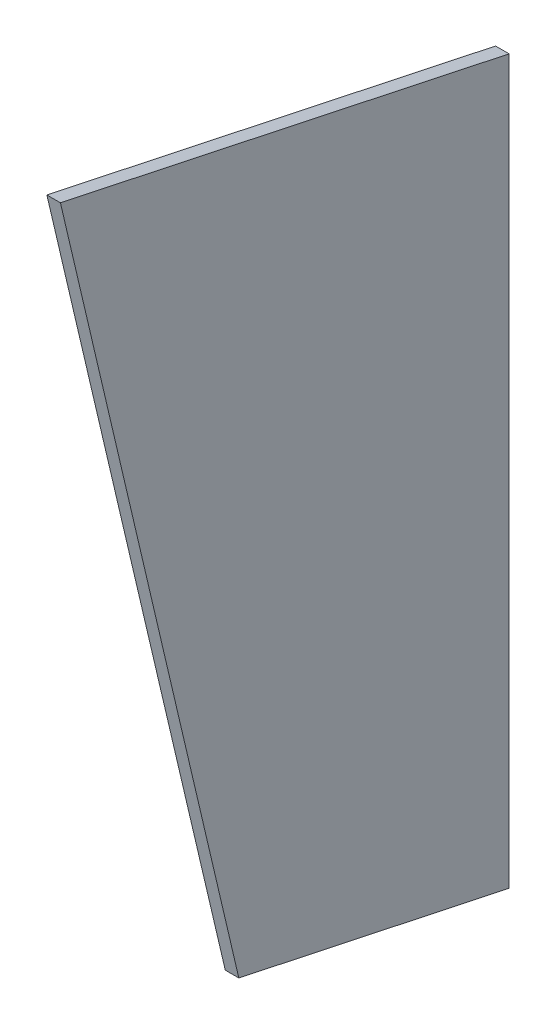
ISO-10303-21;
HEADER;
FILE_DESCRIPTION(('STEP AP214'),'2;1');
FILE_NAME('part.step','',(''),(''),'','','');
FILE_SCHEMA(('AUTOMOTIVE_DESIGN { 1 0 10303 214 1 1 1 1 }'));
ENDSEC;
DATA;
#1=APPLICATION_CONTEXT('core data for automotive mechanical design processes');
#2=APPLICATION_PROTOCOL_DEFINITION('international standard','automotive_design',2000,#1);
#3=PRODUCT_CONTEXT('',#1,'mechanical');
#4=PRODUCT('Part','Part','',(#3));
#5=PRODUCT_RELATED_PRODUCT_CATEGORY('part','',(#4));
#6=PRODUCT_DEFINITION_FORMATION('','',#4);
#7=PRODUCT_DEFINITION_CONTEXT('part definition',#1,'design');
#8=PRODUCT_DEFINITION('design','',#6,#7);
#9=PRODUCT_DEFINITION_SHAPE('','',#8);
#10=(LENGTH_UNIT() NAMED_UNIT(*) SI_UNIT(.MILLI.,.METRE.));
#11=(NAMED_UNIT(*) PLANE_ANGLE_UNIT() SI_UNIT($,.RADIAN.));
#12=(NAMED_UNIT(*) SI_UNIT($,.STERADIAN.) SOLID_ANGLE_UNIT());
#13=UNCERTAINTY_MEASURE_WITH_UNIT(LENGTH_MEASURE(1.E-05),#10,'distance_accuracy_value','');
#14=(GEOMETRIC_REPRESENTATION_CONTEXT(3) GLOBAL_UNCERTAINTY_ASSIGNED_CONTEXT((#13)) GLOBAL_UNIT_ASSIGNED_CONTEXT((#10,
#11,#12)) REPRESENTATION_CONTEXT('',''));
#15=CARTESIAN_POINT('',(0.,0.,0.));
#16=DIRECTION('',(0.,0.,1.));
#17=DIRECTION('',(1.,0.,0.));
#18=AXIS2_PLACEMENT_3D('',#15,#16,#17);
#19=CARTESIAN_POINT('',(-80.1249386153009,-1935.53436525784,862.349124245649));
#20=DIRECTION('',(1.,0.,0.));
#21=DIRECTION('',(0.,0.,-1.));
#22=AXIS2_PLACEMENT_3D('',#19,#20,#21);
#23=PLANE('',#22);
#24=DIRECTION('',(0.,-0.973574424425513,-0.228369963227504));
#25=VECTOR('',#24,1.);
#26=CARTESIAN_POINT('',(-80.1249386153009,-1780.8379906916,202.855941777503));
#27=LINE('',#26,#25);
#28=CARTESIAN_POINT('',(-80.1249386153009,-1422.86580120376,286.824967358723));
#29=VERTEX_POINT('',#28);
#30=CARTESIAN_POINT('',(-80.1249386153009,-2091.18772361778,130.057647863979));
#31=VERTEX_POINT('',#30);
#32=EDGE_CURVE('E89',#29,#31,#27,.T.);
#33=ORIENTED_EDGE('',*,*,#32,.F.);
#34=DIRECTION('',(0.,-0.207911690817753,-0.978147600733807));
#35=VECTOR('',#34,1.);
#36=CARTESIAN_POINT('',(-80.1249386153009,-1300.53436525784,862.349124245649));
#37=LINE('',#36,#35);
#38=CARTESIAN_POINT('',(-80.1249386153009,-1506.67384325097,-107.46087067306));
#39=VERTEX_POINT('',#38);
#40=EDGE_CURVE('E43',#29,#39,#37,.T.);
#41=ORIENTED_EDGE('',*,*,#40,.T.);
#42=DIRECTION('',(0.,-1.,0.));
#43=VECTOR('',#42,1.);
#44=CARTESIAN_POINT('',(-80.1249386153009,-2141.67384325097,-107.46087067306));
#45=LINE('',#44,#43);
#46=CARTESIAN_POINT('',(-80.1249386153009,-2141.67384325097,-107.46087067306));
#47=VERTEX_POINT('',#46);
#48=EDGE_CURVE('E87',#39,#47,#45,.T.);
#49=ORIENTED_EDGE('',*,*,#48,.T.);
#50=DIRECTION('',(0.,-0.207911690817753,-0.978147600733807));
#51=VECTOR('',#50,1.);
#52=CARTESIAN_POINT('',(-80.1249386153009,-1935.53436525784,862.349124245649));
#53=LINE('',#52,#51);
#54=EDGE_CURVE('E78',#31,#47,#53,.T.);
#55=ORIENTED_EDGE('',*,*,#54,.F.);
#56=EDGE_LOOP('',(#33,#41,#49,#55));
#57=FACE_BOUND('',#56,.T.);
#58=ADVANCED_FACE('F39',(#57),#23,.F.);
#59=CARTESIAN_POINT('',(-80.1249386153009,-1935.53436525784,862.349124245649));
#60=DIRECTION('',(0.,0.978147600733807,-0.207911690817753));
#61=DIRECTION('',(0.,0.207911690817753,0.978147600733807));
#62=AXIS2_PLACEMENT_3D('',#59,#60,#61);
#63=PLANE('',#62);
#64=DIRECTION('',(1.,0.,0.));
#65=VECTOR('',#64,1.);
#66=CARTESIAN_POINT('',(-80.1249386153009,-2091.18772361778,130.057647863979));
#67=LINE('',#66,#65);
#68=CARTESIAN_POINT('',(-68.2186886153009,-2091.18772361778,130.057647863979));
#69=VERTEX_POINT('',#68);
#70=EDGE_CURVE('E48',#31,#69,#67,.T.);
#71=ORIENTED_EDGE('',*,*,#70,.F.);
#72=ORIENTED_EDGE('',*,*,#54,.T.);
#73=DIRECTION('',(1.,0.,0.));
#74=VECTOR('',#73,1.);
#75=CARTESIAN_POINT('',(-80.1249386153009,-2141.67384325097,-107.46087067306));
#76=LINE('',#75,#74);
#77=CARTESIAN_POINT('',(-68.2186886153009,-2141.67384325097,-107.46087067306));
#78=VERTEX_POINT('',#77);
#79=EDGE_CURVE('E99',#47,#78,#76,.T.);
#80=ORIENTED_EDGE('',*,*,#79,.T.);
#81=DIRECTION('',(0.,-0.207911690817753,-0.978147600733807));
#82=VECTOR('',#81,1.);
#83=CARTESIAN_POINT('',(-68.2186886153009,-1935.53436525784,862.349124245649));
#84=LINE('',#83,#82);
#85=EDGE_CURVE('E108',#69,#78,#84,.T.);
#86=ORIENTED_EDGE('',*,*,#85,.F.);
#87=EDGE_LOOP('',(#71,#72,#80,#86));
#88=FACE_BOUND('',#87,.T.);
#89=ADVANCED_FACE('F112',(#88),#63,.F.);
#90=CARTESIAN_POINT('',(-68.2186886153009,-1935.53436525784,862.349124245649));
#91=DIRECTION('',(-1.,0.,0.));
#92=DIRECTION('',(0.,0.,1.));
#93=AXIS2_PLACEMENT_3D('',#90,#91,#92);
#94=PLANE('',#93);
#95=DIRECTION('',(0.,0.973574424425513,0.228369963227504));
#96=VECTOR('',#95,1.);
#97=CARTESIAN_POINT('',(-68.2186886153009,-1780.8379906916,202.855941777503));
#98=LINE('',#97,#96);
#99=CARTESIAN_POINT('',(-68.2186886153009,-1422.86580120376,286.824967358723));
#100=VERTEX_POINT('',#99);
#101=EDGE_CURVE('E11',#69,#100,#98,.T.);
#102=ORIENTED_EDGE('',*,*,#101,.F.);
#103=ORIENTED_EDGE('',*,*,#85,.T.);
#104=DIRECTION('',(0.,1.,0.));
#105=VECTOR('',#104,1.);
#106=CARTESIAN_POINT('',(-68.2186886153009,-2141.67384325097,-107.46087067306));
#107=LINE('',#106,#105);
#108=CARTESIAN_POINT('',(-68.2186886153009,-1506.67384325097,-107.46087067306));
#109=VERTEX_POINT('',#108);
#110=EDGE_CURVE('E109',#78,#109,#107,.T.);
#111=ORIENTED_EDGE('',*,*,#110,.T.);
#112=DIRECTION('',(0.,-0.207911690817753,-0.978147600733807));
#113=VECTOR('',#112,1.);
#114=CARTESIAN_POINT('',(-68.2186886153009,-1300.53436525784,862.349124245649));
#115=LINE('',#114,#113);
#116=EDGE_CURVE('E61',#100,#109,#115,.T.);
#117=ORIENTED_EDGE('',*,*,#116,.F.);
#118=EDGE_LOOP('',(#102,#103,#111,#117));
#119=FACE_BOUND('',#118,.T.);
#120=ADVANCED_FACE('F111',(#119),#94,.F.);
#121=CARTESIAN_POINT('',(-80.1249386153009,-1300.53436525784,862.349124245649));
#122=DIRECTION('',(0.,-0.978147600733807,0.207911690817753));
#123=DIRECTION('',(0.,-0.207911690817753,-0.978147600733807));
#124=AXIS2_PLACEMENT_3D('',#121,#122,#123);
#125=PLANE('',#124);
#126=DIRECTION('',(-1.,0.,0.));
#127=VECTOR('',#126,1.);
#128=CARTESIAN_POINT('',(-80.1249386153009,-1422.86580120376,286.824967358723));
#129=LINE('',#128,#127);
#130=EDGE_CURVE('E96',#100,#29,#129,.T.);
#131=ORIENTED_EDGE('',*,*,#130,.F.);
#132=ORIENTED_EDGE('',*,*,#116,.T.);
#133=DIRECTION('',(-1.,0.,0.));
#134=VECTOR('',#133,1.);
#135=CARTESIAN_POINT('',(-80.1249386153009,-1506.67384325097,-107.46087067306));
#136=LINE('',#135,#134);
#137=EDGE_CURVE('E92',#109,#39,#136,.T.);
#138=ORIENTED_EDGE('',*,*,#137,.T.);
#139=ORIENTED_EDGE('',*,*,#40,.F.);
#140=EDGE_LOOP('',(#131,#132,#138,#139));
#141=FACE_BOUND('',#140,.T.);
#142=ADVANCED_FACE('F93',(#141),#125,.F.);
#143=CARTESIAN_POINT('',(0.,0.,-107.46087067306));
#144=DIRECTION('',(0.,0.,-1.));
#145=DIRECTION('',(-1.,0.,0.));
#146=AXIS2_PLACEMENT_3D('',#143,#144,#145);
#147=PLANE('',#146);
#148=ORIENTED_EDGE('',*,*,#48,.F.);
#149=ORIENTED_EDGE('',*,*,#137,.F.);
#150=ORIENTED_EDGE('',*,*,#110,.F.);
#151=ORIENTED_EDGE('',*,*,#79,.F.);
#152=EDGE_LOOP('',(#148,#149,#150,#151));
#153=FACE_BOUND('',#152,.T.);
#154=ADVANCED_FACE('F98',(#153),#147,.T.);
#155=CARTESIAN_POINT('',(-74.1718136153151,-2184.14574865873,108.252616602163));
#156=DIRECTION('',(0.,-0.228369963227504,0.973574424425513));
#157=DIRECTION('',(0.,-0.973574424425513,-0.228369963227504));
#158=AXIS2_PLACEMENT_3D('',#155,#156,#157);
#159=PLANE('',#158);
#160=ORIENTED_EDGE('',*,*,#130,.T.);
#161=ORIENTED_EDGE('',*,*,#32,.T.);
#162=ORIENTED_EDGE('',*,*,#70,.T.);
#163=ORIENTED_EDGE('',*,*,#101,.T.);
#164=EDGE_LOOP('',(#160,#161,#162,#163));
#165=FACE_BOUND('',#164,.T.);
#166=ADVANCED_FACE('F41',(#165),#159,.T.);
#167=CLOSED_SHELL('',(#58,#89,#120,#142,#154,#166));
#168=MANIFOLD_SOLID_BREP('B2',#167);
#169=ADVANCED_BREP_SHAPE_REPRESENTATION('',(#18,#168),#14);
#170=SHAPE_DEFINITION_REPRESENTATION(#9,#169);
ENDSEC;
END-ISO-10303-21;
